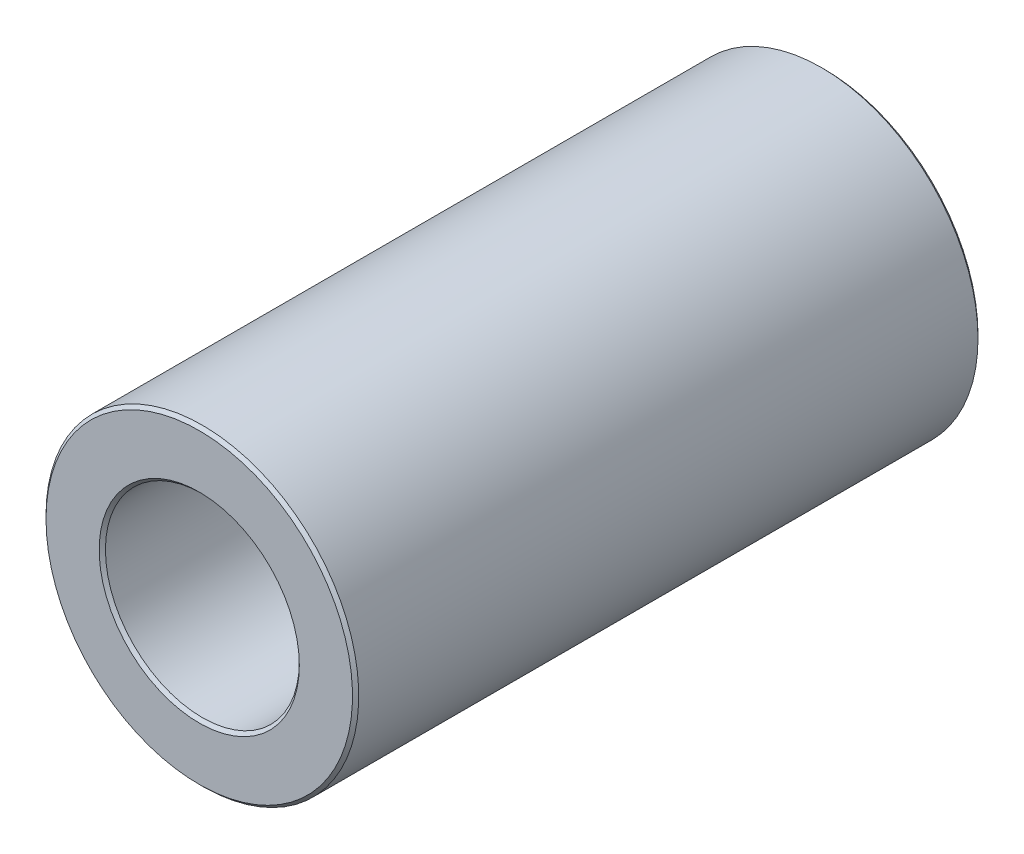
ISO-10303-21;
HEADER;
FILE_DESCRIPTION(('STEP AP214'),'2;1');
FILE_NAME('part.step','',(''),(''),'','','');
FILE_SCHEMA(('AUTOMOTIVE_DESIGN { 1 0 10303 214 1 1 1 1 }'));
ENDSEC;
DATA;
#1=APPLICATION_CONTEXT('core data for automotive mechanical design processes');
#2=APPLICATION_PROTOCOL_DEFINITION('international standard','automotive_design',2000,#1);
#3=PRODUCT_CONTEXT('',#1,'mechanical');
#4=PRODUCT('Part','Part','',(#3));
#5=PRODUCT_RELATED_PRODUCT_CATEGORY('part','',(#4));
#6=PRODUCT_DEFINITION_FORMATION('','',#4);
#7=PRODUCT_DEFINITION_CONTEXT('part definition',#1,'design');
#8=PRODUCT_DEFINITION('design','',#6,#7);
#9=PRODUCT_DEFINITION_SHAPE('','',#8);
#10=(LENGTH_UNIT() NAMED_UNIT(*) SI_UNIT(.MILLI.,.METRE.));
#11=(NAMED_UNIT(*) PLANE_ANGLE_UNIT() SI_UNIT($,.RADIAN.));
#12=(NAMED_UNIT(*) SI_UNIT($,.STERADIAN.) SOLID_ANGLE_UNIT());
#13=UNCERTAINTY_MEASURE_WITH_UNIT(LENGTH_MEASURE(1.E-05),#10,'distance_accuracy_value','');
#14=(GEOMETRIC_REPRESENTATION_CONTEXT(3) GLOBAL_UNCERTAINTY_ASSIGNED_CONTEXT((#13)) GLOBAL_UNIT_ASSIGNED_CONTEXT((#10,
#11,#12)) REPRESENTATION_CONTEXT('',''));
#15=CARTESIAN_POINT('',(0.,0.,0.));
#16=DIRECTION('',(0.,0.,1.));
#17=DIRECTION('',(1.,0.,0.));
#18=AXIS2_PLACEMENT_3D('',#15,#16,#17);
#19=CARTESIAN_POINT('',(0.,0.,5.));
#20=DIRECTION('',(0.,0.,1.));
#21=DIRECTION('',(1.,0.,0.));
#22=AXIS2_PLACEMENT_3D('',#19,#20,#21);
#23=PLANE('',#22);
#24=CARTESIAN_POINT('',(0.,0.,5.));
#25=DIRECTION('',(0.,0.,1.));
#26=DIRECTION('',(1.,0.,0.));
#27=AXIS2_PLACEMENT_3D('',#24,#25,#26);
#28=CIRCLE('',#27,2.45);
#29=CARTESIAN_POINT('',(-2.45,0.,5.));
#30=VERTEX_POINT('',#29);
#31=EDGE_CURVE('E10',#30,#30,#28,.T.);
#32=ORIENTED_EDGE('',*,*,#31,.T.);
#33=EDGE_LOOP('',(#32));
#34=FACE_BOUND('',#33,.T.);
#35=CARTESIAN_POINT('',(0.,0.,5.));
#36=DIRECTION('',(0.,0.,1.));
#37=DIRECTION('',(1.,0.,0.));
#38=AXIS2_PLACEMENT_3D('',#35,#36,#37);
#39=CIRCLE('',#38,1.6);
#40=CARTESIAN_POINT('',(1.6,0.,5.));
#41=VERTEX_POINT('',#40);
#42=EDGE_CURVE('E44',#41,#41,#39,.F.);
#43=ORIENTED_EDGE('',*,*,#42,.T.);
#44=EDGE_LOOP('',(#43));
#45=FACE_BOUND('',#44,.T.);
#46=ADVANCED_FACE('F36',(#34,#45),#23,.T.);
#47=CARTESIAN_POINT('',(0.,0.,-5.));
#48=DIRECTION('',(0.,0.,1.));
#49=DIRECTION('',(1.,0.,0.));
#50=AXIS2_PLACEMENT_3D('',#47,#48,#49);
#51=PLANE('',#50);
#52=CARTESIAN_POINT('',(0.,0.,-5.));
#53=DIRECTION('',(0.,0.,1.));
#54=DIRECTION('',(1.,0.,0.));
#55=AXIS2_PLACEMENT_3D('',#52,#53,#54);
#56=CIRCLE('',#55,1.6);
#57=CARTESIAN_POINT('',(1.6,0.,-5.));
#58=VERTEX_POINT('',#57);
#59=EDGE_CURVE('E63',#58,#58,#56,.T.);
#60=ORIENTED_EDGE('',*,*,#59,.T.);
#61=EDGE_LOOP('',(#60));
#62=FACE_BOUND('',#61,.T.);
#63=CARTESIAN_POINT('',(0.,0.,-5.));
#64=DIRECTION('',(0.,0.,1.));
#65=DIRECTION('',(1.,0.,0.));
#66=AXIS2_PLACEMENT_3D('',#63,#64,#65);
#67=CIRCLE('',#66,2.45);
#68=CARTESIAN_POINT('',(2.45,0.,-5.));
#69=VERTEX_POINT('',#68);
#70=EDGE_CURVE('E66',#69,#69,#67,.F.);
#71=ORIENTED_EDGE('',*,*,#70,.T.);
#72=EDGE_LOOP('',(#71));
#73=FACE_BOUND('',#72,.T.);
#74=ADVANCED_FACE('F70',(#62,#73),#51,.F.);
#75=CARTESIAN_POINT('',(0.,0.,5.));
#76=DIRECTION('',(0.,0.,-1.));
#77=DIRECTION('',(-1.,0.,0.));
#78=AXIS2_PLACEMENT_3D('',#75,#76,#77);
#79=CYLINDRICAL_SURFACE('',#78,2.5);
#80=CARTESIAN_POINT('',(0.,0.,-4.95));
#81=DIRECTION('',(0.,0.,1.));
#82=DIRECTION('',(1.,0.,0.));
#83=AXIS2_PLACEMENT_3D('',#80,#81,#82);
#84=CIRCLE('',#83,2.5);
#85=CARTESIAN_POINT('',(2.5,0.,-4.95));
#86=VERTEX_POINT('',#85);
#87=EDGE_CURVE('E48',#86,#86,#84,.T.);
#88=ORIENTED_EDGE('',*,*,#87,.T.);
#89=EDGE_LOOP('',(#88));
#90=FACE_BOUND('',#89,.T.);
#91=CARTESIAN_POINT('',(0.,0.,4.95));
#92=DIRECTION('',(0.,0.,1.));
#93=DIRECTION('',(1.,0.,0.));
#94=AXIS2_PLACEMENT_3D('',#91,#92,#93);
#95=CIRCLE('',#94,2.5);
#96=CARTESIAN_POINT('',(-2.5,0.,4.95));
#97=VERTEX_POINT('',#96);
#98=EDGE_CURVE('E52',#97,#97,#95,.F.);
#99=ORIENTED_EDGE('',*,*,#98,.T.);
#100=EDGE_LOOP('',(#99));
#101=FACE_BOUND('',#100,.T.);
#102=ADVANCED_FACE('F80',(#90,#101),#79,.T.);
#103=CARTESIAN_POINT('',(0.,0.,5.));
#104=DIRECTION('',(0.,0.,-1.));
#105=DIRECTION('',(-1.,0.,0.));
#106=AXIS2_PLACEMENT_3D('',#103,#104,#105);
#107=CYLINDRICAL_SURFACE('',#106,1.55);
#108=CARTESIAN_POINT('',(0.,0.,-4.95));
#109=DIRECTION('',(0.,0.,1.));
#110=DIRECTION('',(1.,0.,0.));
#111=AXIS2_PLACEMENT_3D('',#108,#109,#110);
#112=CIRCLE('',#111,1.55);
#113=CARTESIAN_POINT('',(1.55,0.,-4.95));
#114=VERTEX_POINT('',#113);
#115=EDGE_CURVE('E57',#114,#114,#112,.F.);
#116=ORIENTED_EDGE('',*,*,#115,.T.);
#117=EDGE_LOOP('',(#116));
#118=FACE_BOUND('',#117,.T.);
#119=CARTESIAN_POINT('',(0.,0.,4.95));
#120=DIRECTION('',(0.,0.,1.));
#121=DIRECTION('',(1.,0.,0.));
#122=AXIS2_PLACEMENT_3D('',#119,#120,#121);
#123=CIRCLE('',#122,1.55);
#124=CARTESIAN_POINT('',(1.55,0.,4.95));
#125=VERTEX_POINT('',#124);
#126=EDGE_CURVE('E60',#125,#125,#123,.T.);
#127=ORIENTED_EDGE('',*,*,#126,.T.);
#128=EDGE_LOOP('',(#127));
#129=FACE_BOUND('',#128,.T.);
#130=ADVANCED_FACE('F83',(#118,#129),#107,.F.);
#131=CARTESIAN_POINT('',(0.,0.,-5.));
#132=DIRECTION('',(0.,0.,-1.));
#133=DIRECTION('',(-1.,0.,0.));
#134=AXIS2_PLACEMENT_3D('',#131,#132,#133);
#135=CONICAL_SURFACE('',#134,1.6,0.785398163397459);
#136=ORIENTED_EDGE('',*,*,#115,.F.);
#137=EDGE_LOOP('',(#136));
#138=FACE_BOUND('',#137,.T.);
#139=ORIENTED_EDGE('',*,*,#59,.F.);
#140=EDGE_LOOP('',(#139));
#141=FACE_BOUND('',#140,.T.);
#142=ADVANCED_FACE('F76',(#138,#141),#135,.F.);
#143=CARTESIAN_POINT('',(0.,0.,-4.95));
#144=DIRECTION('',(0.,0.,1.));
#145=DIRECTION('',(1.,0.,0.));
#146=AXIS2_PLACEMENT_3D('',#143,#144,#145);
#147=CONICAL_SURFACE('',#146,2.5,0.785398163397461);
#148=ORIENTED_EDGE('',*,*,#70,.F.);
#149=EDGE_LOOP('',(#148));
#150=FACE_BOUND('',#149,.T.);
#151=ORIENTED_EDGE('',*,*,#87,.F.);
#152=EDGE_LOOP('',(#151));
#153=FACE_BOUND('',#152,.T.);
#154=ADVANCED_FACE('F72',(#150,#153),#147,.T.);
#155=CARTESIAN_POINT('',(0.,0.,5.));
#156=DIRECTION('',(0.,0.,-1.));
#157=DIRECTION('',(-1.,0.,0.));
#158=AXIS2_PLACEMENT_3D('',#155,#156,#157);
#159=CONICAL_SURFACE('',#158,2.45,0.785398163397453);
#160=CARTESIAN_POINT('',(-2.5,0.,4.95));
#161=CARTESIAN_POINT('',(-2.49947916666667,0.,4.95052083333334));
#162=CARTESIAN_POINT('',(-2.49895833333333,0.,4.95104166666667));
#163=CARTESIAN_POINT('',(-2.49791666666667,0.,4.95208333333334));
#164=CARTESIAN_POINT('',(-2.49739583333333,0.,4.95260416666667));
#165=CARTESIAN_POINT('',(-2.49635416666667,0.,4.95364583333334));
#166=CARTESIAN_POINT('',(-2.49583333333333,0.,4.95416666666667));
#167=CARTESIAN_POINT('',(-2.49479166666667,0.,4.95520833333334));
#168=CARTESIAN_POINT('',(-2.49427083333333,0.,4.95572916666667));
#169=CARTESIAN_POINT('',(-2.49322916666667,0.,4.95677083333334));
#170=CARTESIAN_POINT('',(-2.49270833333333,0.,4.95729166666667));
#171=CARTESIAN_POINT('',(-2.49166666666667,0.,4.95833333333334));
#172=CARTESIAN_POINT('',(-2.49114583333333,0.,4.95885416666667));
#173=CARTESIAN_POINT('',(-2.49010416666667,0.,4.95989583333334));
#174=CARTESIAN_POINT('',(-2.48958333333333,0.,4.96041666666667));
#175=CARTESIAN_POINT('',(-2.48854166666667,0.,4.96145833333333));
#176=CARTESIAN_POINT('',(-2.48802083333333,0.,4.96197916666667));
#177=CARTESIAN_POINT('',(-2.48697916666667,0.,4.96302083333333));
#178=CARTESIAN_POINT('',(-2.48645833333333,0.,4.96354166666667));
#179=CARTESIAN_POINT('',(-2.48541666666667,0.,4.96458333333333));
#180=CARTESIAN_POINT('',(-2.48489583333333,0.,4.96510416666667));
#181=CARTESIAN_POINT('',(-2.48385416666667,0.,4.96614583333333));
#182=CARTESIAN_POINT('',(-2.48333333333333,0.,4.96666666666667));
#183=CARTESIAN_POINT('',(-2.48229166666667,0.,4.96770833333334));
#184=CARTESIAN_POINT('',(-2.48177083333333,0.,4.96822916666667));
#185=CARTESIAN_POINT('',(-2.48072916666667,0.,4.96927083333334));
#186=CARTESIAN_POINT('',(-2.48020833333333,0.,4.96979166666667));
#187=CARTESIAN_POINT('',(-2.47916666666667,0.,4.97083333333333));
#188=CARTESIAN_POINT('',(-2.47864583333333,0.,4.97135416666667));
#189=CARTESIAN_POINT('',(-2.47760416666667,0.,4.97239583333333));
#190=CARTESIAN_POINT('',(-2.47708333333334,0.,4.97291666666667));
#191=CARTESIAN_POINT('',(-2.47604166666667,0.,4.97395833333333));
#192=CARTESIAN_POINT('',(-2.47552083333334,0.,4.97447916666667));
#193=CARTESIAN_POINT('',(-2.47447916666667,0.,4.97552083333333));
#194=CARTESIAN_POINT('',(-2.47395833333333,0.,4.97604166666667));
#195=CARTESIAN_POINT('',(-2.47291666666667,0.,4.97708333333333));
#196=CARTESIAN_POINT('',(-2.47239583333334,0.,4.97760416666667));
#197=CARTESIAN_POINT('',(-2.47135416666667,0.,4.97864583333333));
#198=CARTESIAN_POINT('',(-2.47083333333334,0.,4.97916666666667));
#199=CARTESIAN_POINT('',(-2.46979166666667,0.,4.98020833333333));
#200=CARTESIAN_POINT('',(-2.46927083333334,0.,4.98072916666667));
#201=CARTESIAN_POINT('',(-2.46822916666667,0.,4.98177083333333));
#202=CARTESIAN_POINT('',(-2.46770833333334,0.,4.98229166666667));
#203=CARTESIAN_POINT('',(-2.46666666666667,0.,4.98333333333333));
#204=CARTESIAN_POINT('',(-2.46614583333334,0.,4.98385416666667));
#205=CARTESIAN_POINT('',(-2.46510416666667,0.,4.98489583333333));
#206=CARTESIAN_POINT('',(-2.46458333333334,0.,4.98541666666667));
#207=CARTESIAN_POINT('',(-2.46354166666667,0.,4.98645833333333));
#208=CARTESIAN_POINT('',(-2.46302083333334,0.,4.98697916666667));
#209=CARTESIAN_POINT('',(-2.46197916666667,0.,4.98802083333333));
#210=CARTESIAN_POINT('',(-2.46145833333334,0.,4.98854166666667));
#211=CARTESIAN_POINT('',(-2.46041666666667,0.,4.98958333333333));
#212=CARTESIAN_POINT('',(-2.45989583333334,0.,4.99010416666667));
#213=CARTESIAN_POINT('',(-2.45885416666667,0.,4.99114583333333));
#214=CARTESIAN_POINT('',(-2.45833333333334,0.,4.99166666666667));
#215=CARTESIAN_POINT('',(-2.45729166666667,0.,4.99270833333333));
#216=CARTESIAN_POINT('',(-2.45677083333334,0.,4.99322916666667));
#217=CARTESIAN_POINT('',(-2.45572916666667,0.,4.99427083333333));
#218=CARTESIAN_POINT('',(-2.45520833333334,0.,4.99479166666667));
#219=CARTESIAN_POINT('',(-2.45416666666667,0.,4.99583333333333));
#220=CARTESIAN_POINT('',(-2.45364583333334,0.,4.99635416666667));
#221=CARTESIAN_POINT('',(-2.45260416666667,0.,4.99739583333333));
#222=CARTESIAN_POINT('',(-2.45208333333334,0.,4.99791666666667));
#223=CARTESIAN_POINT('',(-2.45104166666667,0.,4.99895833333333));
#224=CARTESIAN_POINT('',(-2.45052083333334,0.,4.99947916666667));
#225=CARTESIAN_POINT('',(-2.45,0.,5.));
#226=B_SPLINE_CURVE_WITH_KNOTS('',3,(#160,#161,#162,#163,#164,#165,#166,#167,#168,#169,#170,
#171,#172,#173,#174,#175,#176,#177,#178,#179,#180,#181,#182,#183,#184,#185,#186,#187,#188,#189,
#190,#191,#192,#193,#194,#195,#196,#197,#198,#199,#200,#201,#202,#203,#204,#205,#206,#207,#208,
#209,#210,#211,#212,#213,#214,#215,#216,#217,#218,#219,#220,#221,#222,#223,#224,#225),
.UNSPECIFIED.,.F.,.F.,(4,2,2,2,2,2,2,2,2,2,2,2,2,2,2,2,2,2,2,2,2,2,2,2,2,2,2,2,2,2,2,2,4),(0.,
0.00220970869120833,0.00441941738241605,0.00662912607362407,0.00883883476483179,
0.0110485434560395,0.0132582521472472,0.0154679608384549,0.017677669529663,0.0198873782208707,
0.0220970869120784,0.0243067956032867,0.0265165042944948,0.0287262129857025,0.0309359216769102,
0.0331456303681179,0.0353553390593256,0.0375650477505337,0.0397747564417414,0.0419844651329491,
0.0441941738241568,0.0464038825153648,0.0486135912065732,0.0508232998977809,0.0530330085889886,
0.0552427172801963,0.0574524259714044,0.0596621346626121,0.0618718433538198,0.0640815520450275,
0.0662912607362355,0.0685009694274433,0.0707106781186516),.UNSPECIFIED.);
#227=EDGE_CURVE('BSEAM75',#97,#30,#226,.T.);
#228=ORIENTED_EDGE('',*,*,#98,.F.);
#229=ORIENTED_EDGE('',*,*,#31,.F.);
#230=ORIENTED_EDGE('',*,*,#227,.T.);
#231=ORIENTED_EDGE('',*,*,#227,.F.);
#232=EDGE_LOOP('',(#228,#230,#229,#231));
#233=FACE_BOUND('',#232,.T.);
#234=ADVANCED_FACE('F75',(#233),#159,.T.);
#235=CARTESIAN_POINT('',(0.,0.,4.95));
#236=DIRECTION('',(0.,0.,1.));
#237=DIRECTION('',(1.,0.,0.));
#238=AXIS2_PLACEMENT_3D('',#235,#236,#237);
#239=CONICAL_SURFACE('',#238,1.55,0.785398163397459);
#240=ORIENTED_EDGE('',*,*,#42,.F.);
#241=EDGE_LOOP('',(#240));
#242=FACE_BOUND('',#241,.T.);
#243=ORIENTED_EDGE('',*,*,#126,.F.);
#244=EDGE_LOOP('',(#243));
#245=FACE_BOUND('',#244,.T.);
#246=ADVANCED_FACE('F39',(#242,#245),#239,.F.);
#247=CLOSED_SHELL('',(#46,#74,#102,#130,#142,#154,#234,#246));
#248=MANIFOLD_SOLID_BREP('B2',#247);
#249=ADVANCED_BREP_SHAPE_REPRESENTATION('',(#18,#248),#14);
#250=SHAPE_DEFINITION_REPRESENTATION(#9,#249);
ENDSEC;
END-ISO-10303-21;
